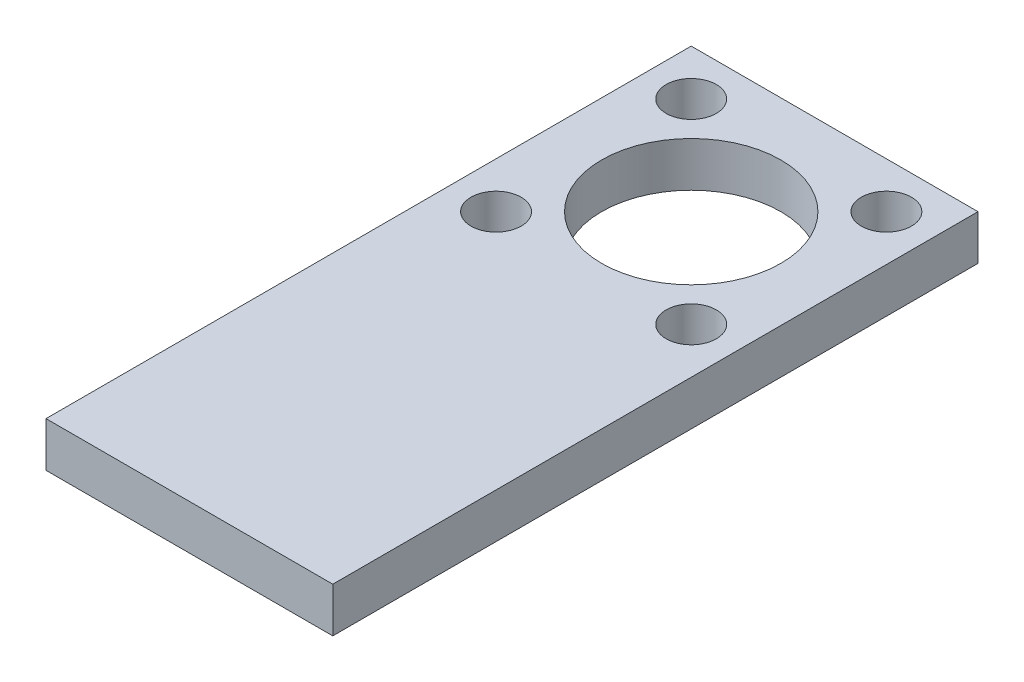
ISO-10303-21;
HEADER;
FILE_DESCRIPTION(('STEP AP214'),'2;1');
FILE_NAME('part.step','',(''),(''),'','','');
FILE_SCHEMA(('AUTOMOTIVE_DESIGN { 1 0 10303 214 1 1 1 1 }'));
ENDSEC;
DATA;
#1=APPLICATION_CONTEXT('core data for automotive mechanical design processes');
#2=APPLICATION_PROTOCOL_DEFINITION('international standard','automotive_design',2000,#1);
#3=PRODUCT_CONTEXT('',#1,'mechanical');
#4=PRODUCT('Part','Part','',(#3));
#5=PRODUCT_RELATED_PRODUCT_CATEGORY('part','',(#4));
#6=PRODUCT_DEFINITION_FORMATION('','',#4);
#7=PRODUCT_DEFINITION_CONTEXT('part definition',#1,'design');
#8=PRODUCT_DEFINITION('design','',#6,#7);
#9=PRODUCT_DEFINITION_SHAPE('','',#8);
#10=(LENGTH_UNIT() NAMED_UNIT(*) SI_UNIT(.MILLI.,.METRE.));
#11=(NAMED_UNIT(*) PLANE_ANGLE_UNIT() SI_UNIT($,.RADIAN.));
#12=(NAMED_UNIT(*) SI_UNIT($,.STERADIAN.) SOLID_ANGLE_UNIT());
#13=UNCERTAINTY_MEASURE_WITH_UNIT(LENGTH_MEASURE(1.E-05),#10,'distance_accuracy_value','');
#14=(GEOMETRIC_REPRESENTATION_CONTEXT(3) GLOBAL_UNCERTAINTY_ASSIGNED_CONTEXT((#13)) GLOBAL_UNIT_ASSIGNED_CONTEXT((#10,
#11,#12)) REPRESENTATION_CONTEXT('',''));
#15=CARTESIAN_POINT('',(0.,0.,0.));
#16=DIRECTION('',(0.,0.,1.));
#17=DIRECTION('',(1.,0.,0.));
#18=AXIS2_PLACEMENT_3D('',#15,#16,#17);
#19=CARTESIAN_POINT('',(0.,3.175,0.));
#20=DIRECTION('',(-1.,0.,0.));
#21=DIRECTION('',(0.,0.,1.));
#22=AXIS2_PLACEMENT_3D('',#19,#20,#21);
#23=PLANE('',#22);
#24=DIRECTION('',(0.,0.,-1.));
#25=VECTOR('',#24,1.);
#26=CARTESIAN_POINT('',(0.,0.,0.));
#27=LINE('',#26,#25);
#28=CARTESIAN_POINT('',(0.,0.,45.72));
#29=VERTEX_POINT('',#28);
#30=CARTESIAN_POINT('',(0.,0.,0.));
#31=VERTEX_POINT('',#30);
#32=EDGE_CURVE('E96',#29,#31,#27,.T.);
#33=ORIENTED_EDGE('',*,*,#32,.T.);
#34=DIRECTION('',(0.,-1.,0.));
#35=VECTOR('',#34,1.);
#36=CARTESIAN_POINT('',(0.,3.175,0.));
#37=LINE('',#36,#35);
#38=CARTESIAN_POINT('',(0.,3.175,0.));
#39=VERTEX_POINT('',#38);
#40=EDGE_CURVE('E11',#39,#31,#37,.T.);
#41=ORIENTED_EDGE('',*,*,#40,.F.);
#42=DIRECTION('',(0.,0.,-1.));
#43=VECTOR('',#42,1.);
#44=CARTESIAN_POINT('',(0.,3.175,0.));
#45=LINE('',#44,#43);
#46=CARTESIAN_POINT('',(0.,3.175,45.72));
#47=VERTEX_POINT('',#46);
#48=EDGE_CURVE('E84',#47,#39,#45,.T.);
#49=ORIENTED_EDGE('',*,*,#48,.F.);
#50=DIRECTION('',(0.,-1.,0.));
#51=VECTOR('',#50,1.);
#52=CARTESIAN_POINT('',(0.,3.175,45.72));
#53=LINE('',#52,#51);
#54=EDGE_CURVE('E92',#47,#29,#53,.T.);
#55=ORIENTED_EDGE('',*,*,#54,.T.);
#56=EDGE_LOOP('',(#33,#41,#49,#55));
#57=FACE_BOUND('',#56,.T.);
#58=ADVANCED_FACE('F33',(#57),#23,.F.);
#59=CARTESIAN_POINT('',(0.,3.175,0.));
#60=DIRECTION('',(0.,0.,1.));
#61=DIRECTION('',(1.,0.,0.));
#62=AXIS2_PLACEMENT_3D('',#59,#60,#61);
#63=PLANE('',#62);
#64=DIRECTION('',(-1.,0.,0.));
#65=VECTOR('',#64,1.);
#66=CARTESIAN_POINT('',(0.,0.,0.));
#67=LINE('',#66,#65);
#68=CARTESIAN_POINT('',(-20.32,0.,0.));
#69=VERTEX_POINT('',#68);
#70=EDGE_CURVE('E88',#31,#69,#67,.T.);
#71=ORIENTED_EDGE('',*,*,#70,.T.);
#72=DIRECTION('',(0.,-1.,0.));
#73=VECTOR('',#72,1.);
#74=CARTESIAN_POINT('',(-20.32,3.175,0.));
#75=LINE('',#74,#73);
#76=CARTESIAN_POINT('',(-20.32,3.175,0.));
#77=VERTEX_POINT('',#76);
#78=EDGE_CURVE('E41',#77,#69,#75,.T.);
#79=ORIENTED_EDGE('',*,*,#78,.F.);
#80=DIRECTION('',(-1.,0.,0.));
#81=VECTOR('',#80,1.);
#82=CARTESIAN_POINT('',(0.,3.175,0.));
#83=LINE('',#82,#81);
#84=EDGE_CURVE('E79',#39,#77,#83,.T.);
#85=ORIENTED_EDGE('',*,*,#84,.F.);
#86=ORIENTED_EDGE('',*,*,#40,.T.);
#87=EDGE_LOOP('',(#71,#79,#85,#86));
#88=FACE_BOUND('',#87,.T.);
#89=ADVANCED_FACE('F87',(#88),#63,.F.);
#90=CARTESIAN_POINT('',(-20.32,3.175,0.));
#91=DIRECTION('',(1.,0.,0.));
#92=DIRECTION('',(0.,0.,-1.));
#93=AXIS2_PLACEMENT_3D('',#90,#91,#92);
#94=PLANE('',#93);
#95=DIRECTION('',(0.,0.,1.));
#96=VECTOR('',#95,1.);
#97=CARTESIAN_POINT('',(-20.32,0.,0.));
#98=LINE('',#97,#96);
#99=CARTESIAN_POINT('',(-20.32,0.,45.72));
#100=VERTEX_POINT('',#99);
#101=EDGE_CURVE('E66',#69,#100,#98,.T.);
#102=ORIENTED_EDGE('',*,*,#101,.T.);
#103=DIRECTION('',(0.,-1.,0.));
#104=VECTOR('',#103,1.);
#105=CARTESIAN_POINT('',(-20.32,3.175,45.72));
#106=LINE('',#105,#104);
#107=CARTESIAN_POINT('',(-20.32,3.175,45.72));
#108=VERTEX_POINT('',#107);
#109=EDGE_CURVE('E89',#108,#100,#106,.T.);
#110=ORIENTED_EDGE('',*,*,#109,.F.);
#111=DIRECTION('',(0.,0.,1.));
#112=VECTOR('',#111,1.);
#113=CARTESIAN_POINT('',(-20.32,3.175,0.));
#114=LINE('',#113,#112);
#115=EDGE_CURVE('E82',#77,#108,#114,.T.);
#116=ORIENTED_EDGE('',*,*,#115,.F.);
#117=ORIENTED_EDGE('',*,*,#78,.T.);
#118=EDGE_LOOP('',(#102,#110,#116,#117));
#119=FACE_BOUND('',#118,.T.);
#120=ADVANCED_FACE('F90',(#119),#94,.F.);
#121=CARTESIAN_POINT('',(0.,3.175,45.72));
#122=DIRECTION('',(0.,0.,-1.));
#123=DIRECTION('',(-1.,0.,0.));
#124=AXIS2_PLACEMENT_3D('',#121,#122,#123);
#125=PLANE('',#124);
#126=DIRECTION('',(1.,0.,0.));
#127=VECTOR('',#126,1.);
#128=CARTESIAN_POINT('',(0.,0.,45.72));
#129=LINE('',#128,#127);
#130=EDGE_CURVE('E72',#100,#29,#129,.T.);
#131=ORIENTED_EDGE('',*,*,#130,.T.);
#132=ORIENTED_EDGE('',*,*,#54,.F.);
#133=DIRECTION('',(1.,0.,0.));
#134=VECTOR('',#133,1.);
#135=CARTESIAN_POINT('',(0.,3.175,45.72));
#136=LINE('',#135,#134);
#137=EDGE_CURVE('E49',#108,#47,#136,.T.);
#138=ORIENTED_EDGE('',*,*,#137,.F.);
#139=ORIENTED_EDGE('',*,*,#109,.T.);
#140=EDGE_LOOP('',(#131,#132,#138,#139));
#141=FACE_BOUND('',#140,.T.);
#142=ADVANCED_FACE('F104',(#141),#125,.F.);
#143=CARTESIAN_POINT('',(0.,3.175,0.));
#144=DIRECTION('',(0.,-1.,0.));
#145=DIRECTION('',(0.,0.,-1.));
#146=AXIS2_PLACEMENT_3D('',#143,#144,#145);
#147=PLANE('',#146);
#148=CARTESIAN_POINT('',(-10.16,3.175,10.16));
#149=DIRECTION('',(0.,1.,0.));
#150=DIRECTION('',(0.,0.,1.));
#151=AXIS2_PLACEMENT_3D('',#148,#149,#150);
#152=CIRCLE('',#151,6.35);
#153=CARTESIAN_POINT('',(-10.16,3.175,16.51));
#154=VERTEX_POINT('',#153);
#155=EDGE_CURVE('E134',#154,#154,#152,.T.);
#156=ORIENTED_EDGE('',*,*,#155,.F.);
#157=EDGE_LOOP('',(#156));
#158=FACE_BOUND('',#157,.T.);
#159=CARTESIAN_POINT('',(-3.24520278677675,3.175,3.24520278677675));
#160=DIRECTION('',(0.,1.,0.));
#161=DIRECTION('',(0.,0.,1.));
#162=AXIS2_PLACEMENT_3D('',#159,#160,#161);
#163=CIRCLE('',#162,1.778);
#164=CARTESIAN_POINT('',(-3.24520278677675,3.175,5.02320278677675));
#165=VERTEX_POINT('',#164);
#166=EDGE_CURVE('E128',#165,#165,#163,.T.);
#167=ORIENTED_EDGE('',*,*,#166,.F.);
#168=EDGE_LOOP('',(#167));
#169=FACE_BOUND('',#168,.T.);
#170=CARTESIAN_POINT('',(-17.0747972132232,3.175,3.24520278677676));
#171=DIRECTION('',(0.,1.,0.));
#172=DIRECTION('',(0.,0.,1.));
#173=AXIS2_PLACEMENT_3D('',#170,#171,#172);
#174=CIRCLE('',#173,1.778);
#175=CARTESIAN_POINT('',(-17.0747972132232,3.175,5.02320278677676));
#176=VERTEX_POINT('',#175);
#177=EDGE_CURVE('E122',#176,#176,#174,.T.);
#178=ORIENTED_EDGE('',*,*,#177,.F.);
#179=EDGE_LOOP('',(#178));
#180=FACE_BOUND('',#179,.T.);
#181=CARTESIAN_POINT('',(-3.24520278677675,3.175,17.0747972132232));
#182=DIRECTION('',(0.,1.,0.));
#183=DIRECTION('',(0.,0.,1.));
#184=AXIS2_PLACEMENT_3D('',#181,#182,#183);
#185=CIRCLE('',#184,1.778);
#186=CARTESIAN_POINT('',(-3.24520278677675,3.175,18.8527972132232));
#187=VERTEX_POINT('',#186);
#188=EDGE_CURVE('E116',#187,#187,#185,.T.);
#189=ORIENTED_EDGE('',*,*,#188,.F.);
#190=EDGE_LOOP('',(#189));
#191=FACE_BOUND('',#190,.T.);
#192=CARTESIAN_POINT('',(-17.0747972132232,3.175,17.0747972132232));
#193=DIRECTION('',(0.,1.,0.));
#194=DIRECTION('',(0.,0.,1.));
#195=AXIS2_PLACEMENT_3D('',#192,#193,#194);
#196=CIRCLE('',#195,1.778);
#197=CARTESIAN_POINT('',(-17.0747972132232,3.175,18.8527972132232));
#198=VERTEX_POINT('',#197);
#199=EDGE_CURVE('E110',#198,#198,#196,.T.);
#200=ORIENTED_EDGE('',*,*,#199,.F.);
#201=EDGE_LOOP('',(#200));
#202=FACE_BOUND('',#201,.T.);
#203=ORIENTED_EDGE('',*,*,#48,.T.);
#204=ORIENTED_EDGE('',*,*,#84,.T.);
#205=ORIENTED_EDGE('',*,*,#115,.T.);
#206=ORIENTED_EDGE('',*,*,#137,.T.);
#207=EDGE_LOOP('',(#203,#204,#205,#206));
#208=FACE_BOUND('',#207,.T.);
#209=ADVANCED_FACE('F80',(#158,#169,#180,#191,#202,#208),#147,.F.);
#210=CARTESIAN_POINT('',(0.,0.,0.));
#211=DIRECTION('',(0.,-1.,0.));
#212=DIRECTION('',(0.,0.,-1.));
#213=AXIS2_PLACEMENT_3D('',#210,#211,#212);
#214=PLANE('',#213);
#215=CARTESIAN_POINT('',(-10.16,0.,10.16));
#216=DIRECTION('',(0.,1.,0.));
#217=DIRECTION('',(0.,0.,1.));
#218=AXIS2_PLACEMENT_3D('',#215,#216,#217);
#219=CIRCLE('',#218,6.35);
#220=CARTESIAN_POINT('',(-10.16,0.,16.51));
#221=VERTEX_POINT('',#220);
#222=EDGE_CURVE('E131',#221,#221,#219,.T.);
#223=ORIENTED_EDGE('',*,*,#222,.T.);
#224=EDGE_LOOP('',(#223));
#225=FACE_BOUND('',#224,.T.);
#226=CARTESIAN_POINT('',(-3.24520278677675,0.,3.24520278677675));
#227=DIRECTION('',(0.,1.,0.));
#228=DIRECTION('',(0.,0.,1.));
#229=AXIS2_PLACEMENT_3D('',#226,#227,#228);
#230=CIRCLE('',#229,1.778);
#231=CARTESIAN_POINT('',(-3.24520278677675,0.,5.02320278677675));
#232=VERTEX_POINT('',#231);
#233=EDGE_CURVE('E125',#232,#232,#230,.T.);
#234=ORIENTED_EDGE('',*,*,#233,.T.);
#235=EDGE_LOOP('',(#234));
#236=FACE_BOUND('',#235,.T.);
#237=CARTESIAN_POINT('',(-17.0747972132232,0.,3.24520278677676));
#238=DIRECTION('',(0.,1.,0.));
#239=DIRECTION('',(0.,0.,1.));
#240=AXIS2_PLACEMENT_3D('',#237,#238,#239);
#241=CIRCLE('',#240,1.778);
#242=CARTESIAN_POINT('',(-17.0747972132232,0.,5.02320278677676));
#243=VERTEX_POINT('',#242);
#244=EDGE_CURVE('E119',#243,#243,#241,.T.);
#245=ORIENTED_EDGE('',*,*,#244,.T.);
#246=EDGE_LOOP('',(#245));
#247=FACE_BOUND('',#246,.T.);
#248=CARTESIAN_POINT('',(-3.24520278677675,0.,17.0747972132232));
#249=DIRECTION('',(0.,1.,0.));
#250=DIRECTION('',(0.,0.,1.));
#251=AXIS2_PLACEMENT_3D('',#248,#249,#250);
#252=CIRCLE('',#251,1.778);
#253=CARTESIAN_POINT('',(-3.24520278677675,0.,18.8527972132232));
#254=VERTEX_POINT('',#253);
#255=EDGE_CURVE('E113',#254,#254,#252,.T.);
#256=ORIENTED_EDGE('',*,*,#255,.T.);
#257=EDGE_LOOP('',(#256));
#258=FACE_BOUND('',#257,.T.);
#259=CARTESIAN_POINT('',(-17.0747972132232,0.,17.0747972132232));
#260=DIRECTION('',(0.,1.,0.));
#261=DIRECTION('',(0.,0.,1.));
#262=AXIS2_PLACEMENT_3D('',#259,#260,#261);
#263=CIRCLE('',#262,1.778);
#264=CARTESIAN_POINT('',(-17.0747972132232,0.,18.8527972132232));
#265=VERTEX_POINT('',#264);
#266=EDGE_CURVE('E99',#265,#265,#263,.T.);
#267=ORIENTED_EDGE('',*,*,#266,.T.);
#268=EDGE_LOOP('',(#267));
#269=FACE_BOUND('',#268,.T.);
#270=ORIENTED_EDGE('',*,*,#32,.F.);
#271=ORIENTED_EDGE('',*,*,#130,.F.);
#272=ORIENTED_EDGE('',*,*,#101,.F.);
#273=ORIENTED_EDGE('',*,*,#70,.F.);
#274=EDGE_LOOP('',(#270,#271,#272,#273));
#275=FACE_BOUND('',#274,.T.);
#276=ADVANCED_FACE('F107',(#225,#236,#247,#258,#269,#275),#214,.T.);
#277=CARTESIAN_POINT('',(-17.0747972132232,0.,17.0747972132232));
#278=DIRECTION('',(0.,1.,0.));
#279=DIRECTION('',(0.,0.,1.));
#280=AXIS2_PLACEMENT_3D('',#277,#278,#279);
#281=CYLINDRICAL_SURFACE('',#280,1.778);
#282=ORIENTED_EDGE('',*,*,#266,.F.);
#283=EDGE_LOOP('',(#282));
#284=FACE_BOUND('',#283,.T.);
#285=ORIENTED_EDGE('',*,*,#199,.T.);
#286=EDGE_LOOP('',(#285));
#287=FACE_BOUND('',#286,.T.);
#288=ADVANCED_FACE('F160',(#284,#287),#281,.F.);
#289=CARTESIAN_POINT('',(-3.24520278677675,0.,17.0747972132232));
#290=DIRECTION('',(0.,1.,0.));
#291=DIRECTION('',(0.,0.,1.));
#292=AXIS2_PLACEMENT_3D('',#289,#290,#291);
#293=CYLINDRICAL_SURFACE('',#292,1.778);
#294=ORIENTED_EDGE('',*,*,#255,.F.);
#295=EDGE_LOOP('',(#294));
#296=FACE_BOUND('',#295,.T.);
#297=ORIENTED_EDGE('',*,*,#188,.T.);
#298=EDGE_LOOP('',(#297));
#299=FACE_BOUND('',#298,.T.);
#300=ADVANCED_FACE('F162',(#296,#299),#293,.F.);
#301=CARTESIAN_POINT('',(-17.0747972132232,0.,3.24520278677676));
#302=DIRECTION('',(0.,1.,0.));
#303=DIRECTION('',(0.,0.,1.));
#304=AXIS2_PLACEMENT_3D('',#301,#302,#303);
#305=CYLINDRICAL_SURFACE('',#304,1.778);
#306=ORIENTED_EDGE('',*,*,#244,.F.);
#307=EDGE_LOOP('',(#306));
#308=FACE_BOUND('',#307,.T.);
#309=ORIENTED_EDGE('',*,*,#177,.T.);
#310=EDGE_LOOP('',(#309));
#311=FACE_BOUND('',#310,.T.);
#312=ADVANCED_FACE('F169',(#308,#311),#305,.F.);
#313=CARTESIAN_POINT('',(-3.24520278677675,0.,3.24520278677675));
#314=DIRECTION('',(0.,1.,0.));
#315=DIRECTION('',(0.,0.,1.));
#316=AXIS2_PLACEMENT_3D('',#313,#314,#315);
#317=CYLINDRICAL_SURFACE('',#316,1.778);
#318=ORIENTED_EDGE('',*,*,#233,.F.);
#319=EDGE_LOOP('',(#318));
#320=FACE_BOUND('',#319,.T.);
#321=ORIENTED_EDGE('',*,*,#166,.T.);
#322=EDGE_LOOP('',(#321));
#323=FACE_BOUND('',#322,.T.);
#324=ADVANCED_FACE('F145',(#320,#323),#317,.F.);
#325=CARTESIAN_POINT('',(-10.16,0.,10.16));
#326=DIRECTION('',(0.,1.,0.));
#327=DIRECTION('',(0.,0.,1.));
#328=AXIS2_PLACEMENT_3D('',#325,#326,#327);
#329=CYLINDRICAL_SURFACE('',#328,6.35);
#330=ORIENTED_EDGE('',*,*,#222,.F.);
#331=EDGE_LOOP('',(#330));
#332=FACE_BOUND('',#331,.T.);
#333=ORIENTED_EDGE('',*,*,#155,.T.);
#334=EDGE_LOOP('',(#333));
#335=FACE_BOUND('',#334,.T.);
#336=ADVANCED_FACE('F142',(#332,#335),#329,.F.);
#337=CLOSED_SHELL('',(#58,#89,#120,#142,#209,#276,#288,#300,#312,#324,#336));
#338=MANIFOLD_SOLID_BREP('B2',#337);
#339=ADVANCED_BREP_SHAPE_REPRESENTATION('',(#18,#338),#14);
#340=SHAPE_DEFINITION_REPRESENTATION(#9,#339);
ENDSEC;
END-ISO-10303-21;
